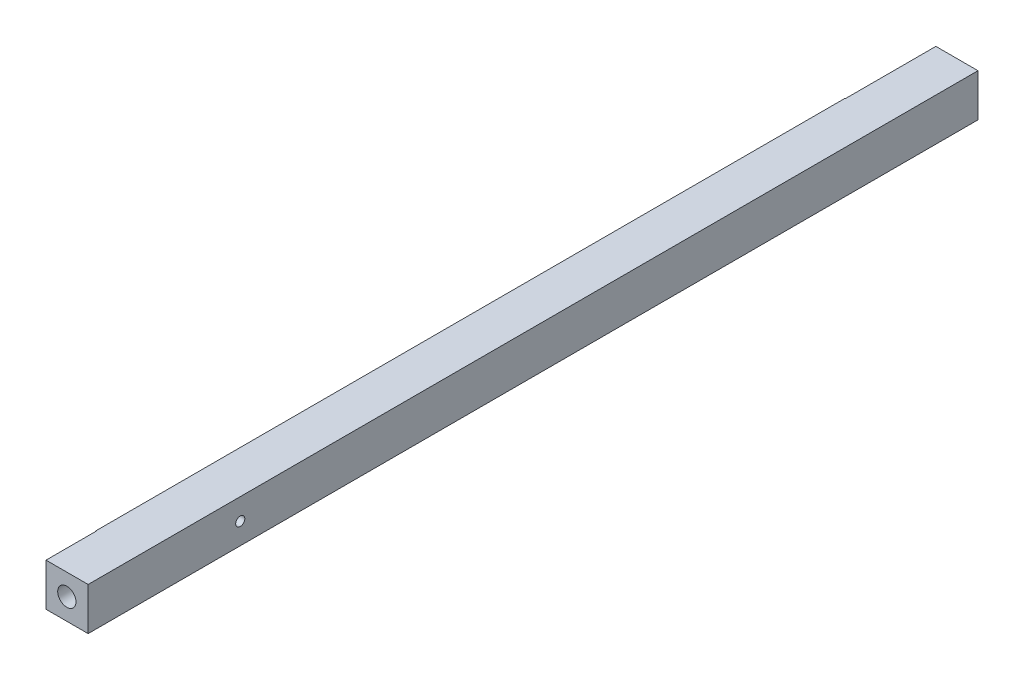
ISO-10303-21;
HEADER;
FILE_DESCRIPTION(('STEP AP214'),'2;1');
FILE_NAME('part.step','',(''),(''),'','','');
FILE_SCHEMA(('AUTOMOTIVE_DESIGN { 1 0 10303 214 1 1 1 1 }'));
ENDSEC;
DATA;
#1=APPLICATION_CONTEXT('core data for automotive mechanical design processes');
#2=APPLICATION_PROTOCOL_DEFINITION('international standard','automotive_design',2000,#1);
#3=PRODUCT_CONTEXT('',#1,'mechanical');
#4=PRODUCT('Part','Part','',(#3));
#5=PRODUCT_RELATED_PRODUCT_CATEGORY('part','',(#4));
#6=PRODUCT_DEFINITION_FORMATION('','',#4);
#7=PRODUCT_DEFINITION_CONTEXT('part definition',#1,'design');
#8=PRODUCT_DEFINITION('design','',#6,#7);
#9=PRODUCT_DEFINITION_SHAPE('','',#8);
#10=(LENGTH_UNIT() NAMED_UNIT(*) SI_UNIT(.MILLI.,.METRE.));
#11=(NAMED_UNIT(*) PLANE_ANGLE_UNIT() SI_UNIT($,.RADIAN.));
#12=(NAMED_UNIT(*) SI_UNIT($,.STERADIAN.) SOLID_ANGLE_UNIT());
#13=UNCERTAINTY_MEASURE_WITH_UNIT(LENGTH_MEASURE(1.E-05),#10,'distance_accuracy_value','');
#14=(GEOMETRIC_REPRESENTATION_CONTEXT(3) GLOBAL_UNCERTAINTY_ASSIGNED_CONTEXT((#13)) GLOBAL_UNIT_ASSIGNED_CONTEXT((#10,
#11,#12)) REPRESENTATION_CONTEXT('',''));
#15=CARTESIAN_POINT('',(0.,0.,0.));
#16=DIRECTION('',(0.,0.,1.));
#17=DIRECTION('',(1.,0.,0.));
#18=AXIS2_PLACEMENT_3D('',#15,#16,#17);
#19=CARTESIAN_POINT('',(14.,0.,485.));
#20=DIRECTION('',(-1.,0.,0.));
#21=DIRECTION('',(0.,0.,1.));
#22=AXIS2_PLACEMENT_3D('',#19,#20,#21);
#23=CYLINDRICAL_SURFACE('',#22,2.99999999999999);
#24=CARTESIAN_POINT('',(14.,0.,485.));
#25=DIRECTION('',(-1.,0.,0.));
#26=DIRECTION('',(0.,0.,1.));
#27=AXIS2_PLACEMENT_3D('',#24,#25,#26);
#28=CIRCLE('',#27,2.99999999999999);
#29=CARTESIAN_POINT('',(14.,0.,488.));
#30=VERTEX_POINT('',#29);
#31=EDGE_CURVE('E135',#30,#30,#28,.T.);
#32=ORIENTED_EDGE('',*,*,#31,.F.);
#33=EDGE_LOOP('',(#32));
#34=FACE_BOUND('',#33,.T.);
#35=CARTESIAN_POINT('',(-8.,0.,485.));
#36=DIRECTION('',(-1.,0.,0.));
#37=DIRECTION('',(0.,0.,1.));
#38=AXIS2_PLACEMENT_3D('',#35,#36,#37);
#39=CIRCLE('',#38,2.99999999999999);
#40=CARTESIAN_POINT('',(-8.,0.,488.));
#41=VERTEX_POINT('',#40);
#42=EDGE_CURVE('E132',#41,#41,#39,.F.);
#43=ORIENTED_EDGE('',*,*,#42,.F.);
#44=EDGE_LOOP('',(#43));
#45=FACE_BOUND('',#44,.T.);
#46=ADVANCED_FACE('F34',(#34,#45),#23,.F.);
#47=CARTESIAN_POINT('',(14.,-14.,585.));
#48=DIRECTION('',(-1.,0.,0.));
#49=DIRECTION('',(0.,0.,1.));
#50=AXIS2_PLACEMENT_3D('',#47,#48,#49);
#51=PLANE('',#50);
#52=ORIENTED_EDGE('',*,*,#31,.T.);
#53=EDGE_LOOP('',(#52));
#54=FACE_BOUND('',#53,.T.);
#55=DIRECTION('',(0.,1.,0.));
#56=VECTOR('',#55,1.);
#57=CARTESIAN_POINT('',(14.,-14.,0.));
#58=LINE('',#57,#56);
#59=CARTESIAN_POINT('',(14.,-14.,0.));
#60=VERTEX_POINT('',#59);
#61=CARTESIAN_POINT('',(14.,14.,0.));
#62=VERTEX_POINT('',#61);
#63=EDGE_CURVE('E152',#60,#62,#58,.T.);
#64=ORIENTED_EDGE('',*,*,#63,.T.);
#65=DIRECTION('',(0.,0.,-1.));
#66=VECTOR('',#65,1.);
#67=CARTESIAN_POINT('',(14.,14.,585.));
#68=LINE('',#67,#66);
#69=CARTESIAN_POINT('',(14.,14.,585.));
#70=VERTEX_POINT('',#69);
#71=EDGE_CURVE('E122',#70,#62,#68,.T.);
#72=ORIENTED_EDGE('',*,*,#71,.F.);
#73=DIRECTION('',(0.,1.,0.));
#74=VECTOR('',#73,1.);
#75=CARTESIAN_POINT('',(14.,-14.,585.));
#76=LINE('',#75,#74);
#77=CARTESIAN_POINT('',(14.,-14.,585.));
#78=VERTEX_POINT('',#77);
#79=EDGE_CURVE('E148',#78,#70,#76,.T.);
#80=ORIENTED_EDGE('',*,*,#79,.F.);
#81=DIRECTION('',(0.,0.,-1.));
#82=VECTOR('',#81,1.);
#83=CARTESIAN_POINT('',(14.,-14.,585.));
#84=LINE('',#83,#82);
#85=EDGE_CURVE('E120',#78,#60,#84,.T.);
#86=ORIENTED_EDGE('',*,*,#85,.T.);
#87=EDGE_LOOP('',(#64,#72,#80,#86));
#88=FACE_BOUND('',#87,.T.);
#89=ADVANCED_FACE('F36',(#54,#88),#51,.F.);
#90=CARTESIAN_POINT('',(-14.,14.,585.));
#91=DIRECTION('',(0.,-1.,0.));
#92=DIRECTION('',(0.,0.,-1.));
#93=AXIS2_PLACEMENT_3D('',#90,#91,#92);
#94=PLANE('',#93);
#95=DIRECTION('',(0.,0.,-1.));
#96=VECTOR('',#95,1.);
#97=CARTESIAN_POINT('',(-14.,14.,585.));
#98=LINE('',#97,#96);
#99=CARTESIAN_POINT('',(-14.,14.,552.));
#100=VERTEX_POINT('',#99);
#101=CARTESIAN_POINT('',(-14.,14.,59.5));
#102=VERTEX_POINT('',#101);
#103=EDGE_CURVE('E117',#100,#102,#98,.T.);
#104=ORIENTED_EDGE('',*,*,#103,.F.);
#105=DIRECTION('',(1.,0.,0.));
#106=VECTOR('',#105,1.);
#107=CARTESIAN_POINT('',(-14.,14.,552.));
#108=LINE('',#107,#106);
#109=CARTESIAN_POINT('',(-13.7,14.,552.));
#110=VERTEX_POINT('',#109);
#111=EDGE_CURVE('E184',#100,#110,#108,.T.);
#112=ORIENTED_EDGE('',*,*,#111,.T.);
#113=DIRECTION('',(0.,0.,1.));
#114=VECTOR('',#113,1.);
#115=CARTESIAN_POINT('',(-13.7,14.,585.));
#116=LINE('',#115,#114);
#117=CARTESIAN_POINT('',(-13.7,14.,585.));
#118=VERTEX_POINT('',#117);
#119=EDGE_CURVE('E191',#110,#118,#116,.T.);
#120=ORIENTED_EDGE('',*,*,#119,.T.);
#121=DIRECTION('',(-1.,0.,0.));
#122=VECTOR('',#121,1.);
#123=CARTESIAN_POINT('',(-14.,14.,585.));
#124=LINE('',#123,#122);
#125=EDGE_CURVE('E144',#70,#118,#124,.T.);
#126=ORIENTED_EDGE('',*,*,#125,.F.);
#127=ORIENTED_EDGE('',*,*,#71,.T.);
#128=DIRECTION('',(-1.,0.,0.));
#129=VECTOR('',#128,1.);
#130=CARTESIAN_POINT('',(-14.,14.,0.));
#131=LINE('',#130,#129);
#132=CARTESIAN_POINT('',(-13.7,14.,0.));
#133=VERTEX_POINT('',#132);
#134=EDGE_CURVE('E155',#62,#133,#131,.T.);
#135=ORIENTED_EDGE('',*,*,#134,.T.);
#136=DIRECTION('',(0.,0.,1.));
#137=VECTOR('',#136,1.);
#138=CARTESIAN_POINT('',(-13.7,14.,585.));
#139=LINE('',#138,#137);
#140=CARTESIAN_POINT('',(-13.7,14.,59.5));
#141=VERTEX_POINT('',#140);
#142=EDGE_CURVE('E57',#133,#141,#139,.T.);
#143=ORIENTED_EDGE('',*,*,#142,.T.);
#144=DIRECTION('',(-1.,0.,0.));
#145=VECTOR('',#144,1.);
#146=CARTESIAN_POINT('',(-14.,14.,59.5));
#147=LINE('',#146,#145);
#148=EDGE_CURVE('E189',#141,#102,#147,.T.);
#149=ORIENTED_EDGE('',*,*,#148,.T.);
#150=EDGE_LOOP('',(#104,#112,#120,#126,#127,#135,#143,#149));
#151=FACE_BOUND('',#150,.T.);
#152=ADVANCED_FACE('F206',(#151),#94,.F.);
#153=CARTESIAN_POINT('',(-14.,-14.,585.));
#154=DIRECTION('',(1.,0.,0.));
#155=DIRECTION('',(0.,0.,-1.));
#156=AXIS2_PLACEMENT_3D('',#153,#154,#155);
#157=PLANE('',#156);
#158=CARTESIAN_POINT('',(-14.,0.,485.));
#159=DIRECTION('',(-1.,0.,0.));
#160=DIRECTION('',(0.,0.,1.));
#161=AXIS2_PLACEMENT_3D('',#158,#159,#160);
#162=CIRCLE('',#161,4.24999999999995);
#163=CARTESIAN_POINT('',(-14.,0.,489.25));
#164=VERTEX_POINT('',#163);
#165=EDGE_CURVE('E181',#164,#164,#162,.T.);
#166=ORIENTED_EDGE('',*,*,#165,.F.);
#167=EDGE_LOOP('',(#166));
#168=FACE_BOUND('',#167,.T.);
#169=DIRECTION('',(0.,0.,-1.));
#170=VECTOR('',#169,1.);
#171=CARTESIAN_POINT('',(-14.,-14.,585.));
#172=LINE('',#171,#170);
#173=CARTESIAN_POINT('',(-14.,-14.,552.));
#174=VERTEX_POINT('',#173);
#175=CARTESIAN_POINT('',(-14.,-14.,59.5));
#176=VERTEX_POINT('',#175);
#177=EDGE_CURVE('E115',#174,#176,#172,.T.);
#178=ORIENTED_EDGE('',*,*,#177,.F.);
#179=DIRECTION('',(0.,-1.,0.));
#180=VECTOR('',#179,1.);
#181=CARTESIAN_POINT('',(-14.,-35.7953036018444,552.));
#182=LINE('',#181,#180);
#183=EDGE_CURVE('E199',#100,#174,#182,.T.);
#184=ORIENTED_EDGE('',*,*,#183,.F.);
#185=ORIENTED_EDGE('',*,*,#103,.T.);
#186=DIRECTION('',(0.,1.,0.));
#187=VECTOR('',#186,1.);
#188=CARTESIAN_POINT('',(-14.,-88.5869080808419,59.5));
#189=LINE('',#188,#187);
#190=EDGE_CURVE('E103',#176,#102,#189,.T.);
#191=ORIENTED_EDGE('',*,*,#190,.F.);
#192=EDGE_LOOP('',(#178,#184,#185,#191));
#193=FACE_BOUND('',#192,.T.);
#194=ADVANCED_FACE('F113',(#168,#193),#157,.F.);
#195=CARTESIAN_POINT('',(-14.,-14.,585.));
#196=DIRECTION('',(0.,1.,0.));
#197=DIRECTION('',(0.,0.,1.));
#198=AXIS2_PLACEMENT_3D('',#195,#196,#197);
#199=PLANE('',#198);
#200=DIRECTION('',(0.,0.,-1.));
#201=VECTOR('',#200,1.);
#202=CARTESIAN_POINT('',(-13.7,-14.,585.));
#203=LINE('',#202,#201);
#204=CARTESIAN_POINT('',(-13.7,-14.,585.));
#205=VERTEX_POINT('',#204);
#206=CARTESIAN_POINT('',(-13.7,-14.,552.));
#207=VERTEX_POINT('',#206);
#208=EDGE_CURVE('E49',#205,#207,#203,.T.);
#209=ORIENTED_EDGE('',*,*,#208,.T.);
#210=DIRECTION('',(-1.,0.,0.));
#211=VECTOR('',#210,1.);
#212=CARTESIAN_POINT('',(-14.,-14.,552.));
#213=LINE('',#212,#211);
#214=EDGE_CURVE('E11',#207,#174,#213,.T.);
#215=ORIENTED_EDGE('',*,*,#214,.T.);
#216=ORIENTED_EDGE('',*,*,#177,.T.);
#217=DIRECTION('',(1.,0.,0.));
#218=VECTOR('',#217,1.);
#219=CARTESIAN_POINT('',(-14.,-14.,59.5));
#220=LINE('',#219,#218);
#221=CARTESIAN_POINT('',(-13.7,-14.,59.5));
#222=VERTEX_POINT('',#221);
#223=EDGE_CURVE('E42',#176,#222,#220,.T.);
#224=ORIENTED_EDGE('',*,*,#223,.T.);
#225=DIRECTION('',(0.,0.,-1.));
#226=VECTOR('',#225,1.);
#227=CARTESIAN_POINT('',(-13.7,-14.,585.));
#228=LINE('',#227,#226);
#229=CARTESIAN_POINT('',(-13.7,-14.,0.));
#230=VERTEX_POINT('',#229);
#231=EDGE_CURVE('E195',#222,#230,#228,.T.);
#232=ORIENTED_EDGE('',*,*,#231,.T.);
#233=DIRECTION('',(1.,0.,0.));
#234=VECTOR('',#233,1.);
#235=CARTESIAN_POINT('',(-14.,-14.,0.));
#236=LINE('',#235,#234);
#237=EDGE_CURVE('E158',#230,#60,#236,.T.);
#238=ORIENTED_EDGE('',*,*,#237,.T.);
#239=ORIENTED_EDGE('',*,*,#85,.F.);
#240=DIRECTION('',(1.,0.,0.));
#241=VECTOR('',#240,1.);
#242=CARTESIAN_POINT('',(-14.,-14.,585.));
#243=LINE('',#242,#241);
#244=EDGE_CURVE('E125',#205,#78,#243,.T.);
#245=ORIENTED_EDGE('',*,*,#244,.F.);
#246=EDGE_LOOP('',(#209,#215,#216,#224,#232,#238,#239,#245));
#247=FACE_BOUND('',#246,.T.);
#248=ADVANCED_FACE('F119',(#247),#199,.F.);
#249=CARTESIAN_POINT('',(0.,0.,585.));
#250=DIRECTION('',(0.,0.,-1.));
#251=DIRECTION('',(-1.,0.,0.));
#252=AXIS2_PLACEMENT_3D('',#249,#250,#251);
#253=PLANE('',#252);
#254=CARTESIAN_POINT('',(0.,0.,585.));
#255=DIRECTION('',(0.,0.,1.));
#256=DIRECTION('',(1.,0.,0.));
#257=AXIS2_PLACEMENT_3D('',#254,#255,#256);
#258=CIRCLE('',#257,6.);
#259=CARTESIAN_POINT('',(6.,0.,585.));
#260=VERTEX_POINT('',#259);
#261=EDGE_CURVE('E162',#260,#260,#258,.T.);
#262=ORIENTED_EDGE('',*,*,#261,.F.);
#263=EDGE_LOOP('',(#262));
#264=FACE_BOUND('',#263,.T.);
#265=ORIENTED_EDGE('',*,*,#125,.T.);
#266=DIRECTION('',(0.,-1.,0.));
#267=VECTOR('',#266,1.);
#268=CARTESIAN_POINT('',(-13.7,0.,585.));
#269=LINE('',#268,#267);
#270=EDGE_CURVE('E109',#118,#205,#269,.T.);
#271=ORIENTED_EDGE('',*,*,#270,.T.);
#272=ORIENTED_EDGE('',*,*,#244,.T.);
#273=ORIENTED_EDGE('',*,*,#79,.T.);
#274=EDGE_LOOP('',(#265,#271,#272,#273));
#275=FACE_BOUND('',#274,.T.);
#276=ADVANCED_FACE('F141',(#264,#275),#253,.F.);
#277=CARTESIAN_POINT('',(0.,0.,0.));
#278=DIRECTION('',(0.,0.,-1.));
#279=DIRECTION('',(-1.,0.,0.));
#280=AXIS2_PLACEMENT_3D('',#277,#278,#279);
#281=PLANE('',#280);
#282=DIRECTION('',(0.,-1.,0.));
#283=VECTOR('',#282,1.);
#284=CARTESIAN_POINT('',(-13.7,0.,0.));
#285=LINE('',#284,#283);
#286=EDGE_CURVE('E131',#133,#230,#285,.T.);
#287=ORIENTED_EDGE('',*,*,#286,.F.);
#288=ORIENTED_EDGE('',*,*,#134,.F.);
#289=ORIENTED_EDGE('',*,*,#63,.F.);
#290=ORIENTED_EDGE('',*,*,#237,.F.);
#291=EDGE_LOOP('',(#287,#288,#289,#290));
#292=FACE_BOUND('',#291,.T.);
#293=CARTESIAN_POINT('',(7.,-7.,0.));
#294=DIRECTION('',(0.,0.,-1.));
#295=DIRECTION('',(-1.,0.,0.));
#296=AXIS2_PLACEMENT_3D('',#293,#294,#295);
#297=CIRCLE('',#296,3.);
#298=CARTESIAN_POINT('',(4.,-7.,0.));
#299=VERTEX_POINT('',#298);
#300=EDGE_CURVE('E174',#299,#299,#297,.T.);
#301=ORIENTED_EDGE('',*,*,#300,.F.);
#302=EDGE_LOOP('',(#301));
#303=FACE_BOUND('',#302,.T.);
#304=CARTESIAN_POINT('',(-7.,7.,0.));
#305=DIRECTION('',(0.,0.,-1.));
#306=DIRECTION('',(-1.,0.,0.));
#307=AXIS2_PLACEMENT_3D('',#304,#305,#306);
#308=CIRCLE('',#307,3.);
#309=CARTESIAN_POINT('',(-10.,7.,0.));
#310=VERTEX_POINT('',#309);
#311=EDGE_CURVE('E168',#310,#310,#308,.T.);
#312=ORIENTED_EDGE('',*,*,#311,.F.);
#313=EDGE_LOOP('',(#312));
#314=FACE_BOUND('',#313,.T.);
#315=ADVANCED_FACE('F210',(#292,#303,#314),#281,.T.);
#316=CARTESIAN_POINT('',(0.,0.,525.));
#317=DIRECTION('',(0.,0.,1.));
#318=DIRECTION('',(1.,0.,0.));
#319=AXIS2_PLACEMENT_3D('',#316,#317,#318);
#320=CYLINDRICAL_SURFACE('',#319,6.);
#321=CARTESIAN_POINT('',(0.,0.,525.));
#322=DIRECTION('',(0.,0.,1.));
#323=DIRECTION('',(1.,0.,0.));
#324=AXIS2_PLACEMENT_3D('',#321,#322,#323);
#325=CIRCLE('',#324,6.);
#326=CARTESIAN_POINT('',(6.,0.,525.));
#327=VERTEX_POINT('',#326);
#328=EDGE_CURVE('E156',#327,#327,#325,.T.);
#329=ORIENTED_EDGE('',*,*,#328,.F.);
#330=EDGE_LOOP('',(#329));
#331=FACE_BOUND('',#330,.T.);
#332=ORIENTED_EDGE('',*,*,#261,.T.);
#333=EDGE_LOOP('',(#332));
#334=FACE_BOUND('',#333,.T.);
#335=ADVANCED_FACE('F259',(#331,#334),#320,.F.);
#336=CARTESIAN_POINT('',(0.,0.,525.));
#337=DIRECTION('',(0.,0.,1.));
#338=DIRECTION('',(1.,0.,0.));
#339=AXIS2_PLACEMENT_3D('',#336,#337,#338);
#340=PLANE('',#339);
#341=ORIENTED_EDGE('',*,*,#328,.T.);
#342=EDGE_LOOP('',(#341));
#343=FACE_BOUND('',#342,.T.);
#344=ADVANCED_FACE('F255',(#343),#340,.T.);
#345=CARTESIAN_POINT('',(-7.,7.,10.));
#346=DIRECTION('',(0.,0.,-1.));
#347=DIRECTION('',(-1.,0.,0.));
#348=AXIS2_PLACEMENT_3D('',#345,#346,#347);
#349=CYLINDRICAL_SURFACE('',#348,3.);
#350=CARTESIAN_POINT('',(-7.,7.,10.));
#351=DIRECTION('',(0.,0.,-1.));
#352=DIRECTION('',(-1.,0.,0.));
#353=AXIS2_PLACEMENT_3D('',#350,#351,#352);
#354=CIRCLE('',#353,3.);
#355=CARTESIAN_POINT('',(-10.,7.,10.));
#356=VERTEX_POINT('',#355);
#357=EDGE_CURVE('E171',#356,#356,#354,.T.);
#358=ORIENTED_EDGE('',*,*,#357,.F.);
#359=EDGE_LOOP('',(#358));
#360=FACE_BOUND('',#359,.T.);
#361=ORIENTED_EDGE('',*,*,#311,.T.);
#362=EDGE_LOOP('',(#361));
#363=FACE_BOUND('',#362,.T.);
#364=ADVANCED_FACE('F251',(#360,#363),#349,.F.);
#365=CARTESIAN_POINT('',(-7.,7.,10.));
#366=DIRECTION('',(0.,0.,-1.));
#367=DIRECTION('',(-1.,0.,0.));
#368=AXIS2_PLACEMENT_3D('',#365,#366,#367);
#369=PLANE('',#368);
#370=ORIENTED_EDGE('',*,*,#357,.T.);
#371=EDGE_LOOP('',(#370));
#372=FACE_BOUND('',#371,.T.);
#373=ADVANCED_FACE('F247',(#372),#369,.T.);
#374=CARTESIAN_POINT('',(7.,-7.,10.));
#375=DIRECTION('',(0.,0.,-1.));
#376=DIRECTION('',(-1.,0.,0.));
#377=AXIS2_PLACEMENT_3D('',#374,#375,#376);
#378=CYLINDRICAL_SURFACE('',#377,3.);
#379=CARTESIAN_POINT('',(7.,-7.,10.));
#380=DIRECTION('',(0.,0.,-1.));
#381=DIRECTION('',(-1.,0.,0.));
#382=AXIS2_PLACEMENT_3D('',#379,#380,#381);
#383=CIRCLE('',#382,3.);
#384=CARTESIAN_POINT('',(4.,-7.,10.));
#385=VERTEX_POINT('',#384);
#386=EDGE_CURVE('E165',#385,#385,#383,.T.);
#387=ORIENTED_EDGE('',*,*,#386,.F.);
#388=EDGE_LOOP('',(#387));
#389=FACE_BOUND('',#388,.T.);
#390=ORIENTED_EDGE('',*,*,#300,.T.);
#391=EDGE_LOOP('',(#390));
#392=FACE_BOUND('',#391,.T.);
#393=ADVANCED_FACE('F239',(#389,#392),#378,.F.);
#394=CARTESIAN_POINT('',(7.,-7.,10.));
#395=DIRECTION('',(0.,0.,-1.));
#396=DIRECTION('',(-1.,0.,0.));
#397=AXIS2_PLACEMENT_3D('',#394,#395,#396);
#398=PLANE('',#397);
#399=ORIENTED_EDGE('',*,*,#386,.T.);
#400=EDGE_LOOP('',(#399));
#401=FACE_BOUND('',#400,.T.);
#402=ADVANCED_FACE('F230',(#401),#398,.T.);
#403=CARTESIAN_POINT('',(-8.,0.,485.));
#404=DIRECTION('',(-1.,0.,0.));
#405=DIRECTION('',(0.,0.,1.));
#406=AXIS2_PLACEMENT_3D('',#403,#404,#405);
#407=PLANE('',#406);
#408=CARTESIAN_POINT('',(-8.,0.,485.));
#409=DIRECTION('',(-1.,0.,0.));
#410=DIRECTION('',(0.,0.,1.));
#411=AXIS2_PLACEMENT_3D('',#408,#409,#410);
#412=CIRCLE('',#411,4.24999999999995);
#413=CARTESIAN_POINT('',(-8.,0.,489.25));
#414=VERTEX_POINT('',#413);
#415=EDGE_CURVE('E136',#414,#414,#412,.T.);
#416=ORIENTED_EDGE('',*,*,#415,.T.);
#417=EDGE_LOOP('',(#416));
#418=FACE_BOUND('',#417,.T.);
#419=ORIENTED_EDGE('',*,*,#42,.T.);
#420=EDGE_LOOP('',(#419));
#421=FACE_BOUND('',#420,.T.);
#422=ADVANCED_FACE('F227',(#418,#421),#407,.T.);
#423=CARTESIAN_POINT('',(-8.,0.,485.));
#424=DIRECTION('',(-1.,0.,0.));
#425=DIRECTION('',(0.,0.,1.));
#426=AXIS2_PLACEMENT_3D('',#423,#424,#425);
#427=CYLINDRICAL_SURFACE('',#426,4.24999999999995);
#428=ORIENTED_EDGE('',*,*,#415,.F.);
#429=EDGE_LOOP('',(#428));
#430=FACE_BOUND('',#429,.T.);
#431=ORIENTED_EDGE('',*,*,#165,.T.);
#432=EDGE_LOOP('',(#431));
#433=FACE_BOUND('',#432,.T.);
#434=ADVANCED_FACE('F229',(#430,#433),#427,.F.);
#435=CARTESIAN_POINT('',(-13.7,-88.5869080808419,59.5));
#436=DIRECTION('',(0.,0.,1.));
#437=DIRECTION('',(1.,0.,0.));
#438=AXIS2_PLACEMENT_3D('',#435,#436,#437);
#439=PLANE('',#438);
#440=DIRECTION('',(0.,1.,0.));
#441=VECTOR('',#440,1.);
#442=CARTESIAN_POINT('',(-13.7,-88.5869080808419,59.5));
#443=LINE('',#442,#441);
#444=EDGE_CURVE('E105',#222,#141,#443,.T.);
#445=ORIENTED_EDGE('',*,*,#444,.F.);
#446=ORIENTED_EDGE('',*,*,#223,.F.);
#447=ORIENTED_EDGE('',*,*,#190,.T.);
#448=ORIENTED_EDGE('',*,*,#148,.F.);
#449=EDGE_LOOP('',(#445,#446,#447,#448));
#450=FACE_BOUND('',#449,.T.);
#451=ADVANCED_FACE('F102',(#450),#439,.F.);
#452=CARTESIAN_POINT('',(-13.7,0.,0.));
#453=DIRECTION('',(1.,0.,0.));
#454=DIRECTION('',(0.,0.,-1.));
#455=AXIS2_PLACEMENT_3D('',#452,#453,#454);
#456=PLANE('',#455);
#457=ORIENTED_EDGE('',*,*,#286,.T.);
#458=ORIENTED_EDGE('',*,*,#231,.F.);
#459=ORIENTED_EDGE('',*,*,#444,.T.);
#460=ORIENTED_EDGE('',*,*,#142,.F.);
#461=EDGE_LOOP('',(#457,#458,#459,#460));
#462=FACE_BOUND('',#461,.T.);
#463=ADVANCED_FACE('F207',(#462),#456,.F.);
#464=CARTESIAN_POINT('',(-13.7,-35.7953036018444,552.));
#465=DIRECTION('',(0.,0.,-1.));
#466=DIRECTION('',(-1.,0.,0.));
#467=AXIS2_PLACEMENT_3D('',#464,#465,#466);
#468=PLANE('',#467);
#469=ORIENTED_EDGE('',*,*,#183,.T.);
#470=ORIENTED_EDGE('',*,*,#214,.F.);
#471=DIRECTION('',(0.,-1.,0.));
#472=VECTOR('',#471,1.);
#473=CARTESIAN_POINT('',(-13.7,-35.7953036018444,552.));
#474=LINE('',#473,#472);
#475=EDGE_CURVE('E196',#110,#207,#474,.T.);
#476=ORIENTED_EDGE('',*,*,#475,.F.);
#477=ORIENTED_EDGE('',*,*,#111,.F.);
#478=EDGE_LOOP('',(#469,#470,#476,#477));
#479=FACE_BOUND('',#478,.T.);
#480=ADVANCED_FACE('F204',(#479),#468,.F.);
#481=CARTESIAN_POINT('',(-13.7,0.,0.));
#482=DIRECTION('',(1.,0.,0.));
#483=DIRECTION('',(0.,0.,-1.));
#484=AXIS2_PLACEMENT_3D('',#481,#482,#483);
#485=PLANE('',#484);
#486=ORIENTED_EDGE('',*,*,#475,.T.);
#487=ORIENTED_EDGE('',*,*,#208,.F.);
#488=ORIENTED_EDGE('',*,*,#270,.F.);
#489=ORIENTED_EDGE('',*,*,#119,.F.);
#490=EDGE_LOOP('',(#486,#487,#488,#489));
#491=FACE_BOUND('',#490,.T.);
#492=ADVANCED_FACE('F202',(#491),#485,.F.);
#493=CLOSED_SHELL('',(#46,#89,#152,#194,#248,#276,#315,#335,#344,#364,#373,#393,#402,#422,#434,
#451,#463,#480,#492));
#494=MANIFOLD_SOLID_BREP('B2',#493);
#495=ADVANCED_BREP_SHAPE_REPRESENTATION('',(#18,#494),#14);
#496=SHAPE_DEFINITION_REPRESENTATION(#9,#495);
ENDSEC;
END-ISO-10303-21;
